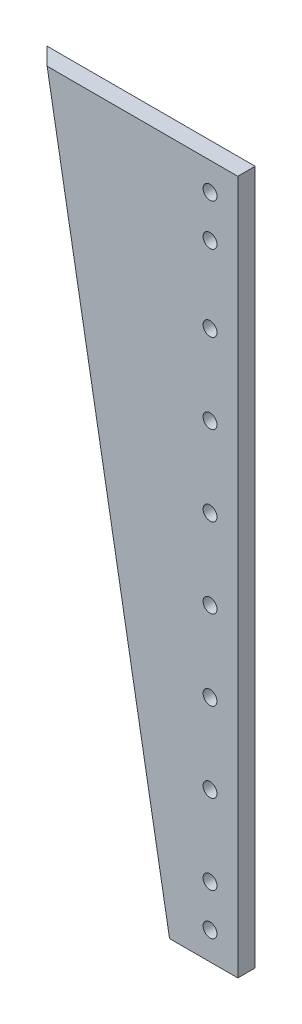
ISO-10303-21;
HEADER;
FILE_DESCRIPTION(('STEP AP214'),'2;1');
FILE_NAME('part.step','',(''),(''),'','','');
FILE_SCHEMA(('AUTOMOTIVE_DESIGN { 1 0 10303 214 1 1 1 1 }'));
ENDSEC;
DATA;
#1=APPLICATION_CONTEXT('core data for automotive mechanical design processes');
#2=APPLICATION_PROTOCOL_DEFINITION('international standard','automotive_design',2000,#1);
#3=PRODUCT_CONTEXT('',#1,'mechanical');
#4=PRODUCT('Part','Part','',(#3));
#5=PRODUCT_RELATED_PRODUCT_CATEGORY('part','',(#4));
#6=PRODUCT_DEFINITION_FORMATION('','',#4);
#7=PRODUCT_DEFINITION_CONTEXT('part definition',#1,'design');
#8=PRODUCT_DEFINITION('design','',#6,#7);
#9=PRODUCT_DEFINITION_SHAPE('','',#8);
#10=(LENGTH_UNIT() NAMED_UNIT(*) SI_UNIT(.MILLI.,.METRE.));
#11=(NAMED_UNIT(*) PLANE_ANGLE_UNIT() SI_UNIT($,.RADIAN.));
#12=(NAMED_UNIT(*) SI_UNIT($,.STERADIAN.) SOLID_ANGLE_UNIT());
#13=UNCERTAINTY_MEASURE_WITH_UNIT(LENGTH_MEASURE(1.E-05),#10,'distance_accuracy_value','');
#14=(GEOMETRIC_REPRESENTATION_CONTEXT(3) GLOBAL_UNCERTAINTY_ASSIGNED_CONTEXT((#13)) GLOBAL_UNIT_ASSIGNED_CONTEXT((#10,
#11,#12)) REPRESENTATION_CONTEXT('',''));
#15=CARTESIAN_POINT('',(0.,0.,0.));
#16=DIRECTION('',(0.,0.,1.));
#17=DIRECTION('',(1.,0.,0.));
#18=AXIS2_PLACEMENT_3D('',#15,#16,#17);
#19=CARTESIAN_POINT('',(-60.,0.,5.));
#20=DIRECTION('',(0.,1.,0.));
#21=DIRECTION('',(0.,0.,1.));
#22=AXIS2_PLACEMENT_3D('',#19,#20,#21);
#23=PLANE('',#22);
#24=DIRECTION('',(1.,0.,0.));
#25=VECTOR('',#24,1.);
#26=CARTESIAN_POINT('',(-60.,0.,5.));
#27=LINE('',#26,#25);
#28=CARTESIAN_POINT('',(-19.6574707988797,0.,5.));
#29=VERTEX_POINT('',#28);
#30=CARTESIAN_POINT('',(0.,0.,5.));
#31=VERTEX_POINT('',#30);
#32=EDGE_CURVE('E77',#29,#31,#27,.T.);
#33=ORIENTED_EDGE('',*,*,#32,.F.);
#34=DIRECTION('',(-0.712498293208669,0.,-0.701673843159864));
#35=VECTOR('',#34,1.);
#36=CARTESIAN_POINT('',(-19.3565613980794,0.,5.29633791086235));
#37=LINE('',#36,#35);
#38=CARTESIAN_POINT('',(-24.7346038583084,0.,0.));
#39=VERTEX_POINT('',#38);
#40=EDGE_CURVE('E41',#29,#39,#37,.T.);
#41=ORIENTED_EDGE('',*,*,#40,.T.);
#42=DIRECTION('',(1.,0.,0.));
#43=VECTOR('',#42,1.);
#44=CARTESIAN_POINT('',(-60.,0.,0.));
#45=LINE('',#44,#43);
#46=CARTESIAN_POINT('',(0.,0.,0.));
#47=VERTEX_POINT('',#46);
#48=EDGE_CURVE('E75',#39,#47,#45,.T.);
#49=ORIENTED_EDGE('',*,*,#48,.T.);
#50=DIRECTION('',(0.,0.,-1.));
#51=VECTOR('',#50,1.);
#52=CARTESIAN_POINT('',(0.,0.,5.));
#53=LINE('',#52,#51);
#54=EDGE_CURVE('E159',#31,#47,#53,.T.);
#55=ORIENTED_EDGE('',*,*,#54,.F.);
#56=EDGE_LOOP('',(#33,#41,#49,#55));
#57=FACE_BOUND('',#56,.T.);
#58=ADVANCED_FACE('F33',(#57),#23,.F.);
#59=CARTESIAN_POINT('',(0.,200.,5.));
#60=DIRECTION('',(-1.,0.,0.));
#61=DIRECTION('',(0.,-1.,0.));
#62=AXIS2_PLACEMENT_3D('',#59,#60,#61);
#63=PLANE('',#62);
#64=DIRECTION('',(0.,1.,0.));
#65=VECTOR('',#64,1.);
#66=CARTESIAN_POINT('',(0.,200.,0.));
#67=LINE('',#66,#65);
#68=CARTESIAN_POINT('',(0.,200.,0.));
#69=VERTEX_POINT('',#68);
#70=EDGE_CURVE('E84',#47,#69,#67,.T.);
#71=ORIENTED_EDGE('',*,*,#70,.T.);
#72=DIRECTION('',(0.,0.,-1.));
#73=VECTOR('',#72,1.);
#74=CARTESIAN_POINT('',(0.,200.,5.));
#75=LINE('',#74,#73);
#76=CARTESIAN_POINT('',(0.,200.,5.));
#77=VERTEX_POINT('',#76);
#78=EDGE_CURVE('E153',#77,#69,#75,.T.);
#79=ORIENTED_EDGE('',*,*,#78,.F.);
#80=DIRECTION('',(0.,1.,0.));
#81=VECTOR('',#80,1.);
#82=CARTESIAN_POINT('',(0.,200.,5.));
#83=LINE('',#82,#81);
#84=EDGE_CURVE('E149',#31,#77,#83,.T.);
#85=ORIENTED_EDGE('',*,*,#84,.F.);
#86=ORIENTED_EDGE('',*,*,#54,.T.);
#87=EDGE_LOOP('',(#71,#79,#85,#86));
#88=FACE_BOUND('',#87,.T.);
#89=ADVANCED_FACE('F168',(#88),#63,.F.);
#90=CARTESIAN_POINT('',(-60.,200.,5.));
#91=DIRECTION('',(0.,-1.,0.));
#92=DIRECTION('',(0.,0.,-1.));
#93=AXIS2_PLACEMENT_3D('',#90,#91,#92);
#94=PLANE('',#93);
#95=DIRECTION('',(-1.,0.,0.));
#96=VECTOR('',#95,1.);
#97=CARTESIAN_POINT('',(-60.,200.,0.));
#98=LINE('',#97,#96);
#99=CARTESIAN_POINT('',(-60.,200.,0.));
#100=VERTEX_POINT('',#99);
#101=EDGE_CURVE('E150',#69,#100,#98,.T.);
#102=ORIENTED_EDGE('',*,*,#101,.T.);
#103=DIRECTION('',(0.712498293208669,0.,0.701673843159864));
#104=VECTOR('',#103,1.);
#105=CARTESIAN_POINT('',(-36.7193445513209,200.,22.9269699810652));
#106=LINE('',#105,#104);
#107=CARTESIAN_POINT('',(-54.9228669405713,200.,5.));
#108=VERTEX_POINT('',#107);
#109=EDGE_CURVE('E11',#100,#108,#106,.T.);
#110=ORIENTED_EDGE('',*,*,#109,.T.);
#111=DIRECTION('',(-1.,0.,0.));
#112=VECTOR('',#111,1.);
#113=CARTESIAN_POINT('',(-60.,200.,5.));
#114=LINE('',#113,#112);
#115=EDGE_CURVE('E152',#77,#108,#114,.T.);
#116=ORIENTED_EDGE('',*,*,#115,.F.);
#117=ORIENTED_EDGE('',*,*,#78,.T.);
#118=EDGE_LOOP('',(#102,#110,#116,#117));
#119=FACE_BOUND('',#118,.T.);
#120=ADVANCED_FACE('F166',(#119),#94,.F.);
#121=CARTESIAN_POINT('',(0.,0.,5.));
#122=DIRECTION('',(0.,0.,1.));
#123=DIRECTION('',(1.,0.,0.));
#124=AXIS2_PLACEMENT_3D('',#121,#122,#123);
#125=PLANE('',#124);
#126=ORIENTED_EDGE('',*,*,#115,.T.);
#127=DIRECTION('',(0.173648177666924,-0.984807753012209,0.));
#128=VECTOR('',#127,1.);
#129=CARTESIAN_POINT('',(-19.8105650932473,0.868240888334619,5.));
#130=LINE('',#129,#128);
#131=EDGE_CURVE('E78',#108,#29,#130,.T.);
#132=ORIENTED_EDGE('',*,*,#131,.T.);
#133=ORIENTED_EDGE('',*,*,#32,.T.);
#134=ORIENTED_EDGE('',*,*,#84,.T.);
#135=EDGE_LOOP('',(#126,#132,#133,#134));
#136=FACE_BOUND('',#135,.T.);
#137=CARTESIAN_POINT('',(-8.,66.,5.));
#138=DIRECTION('',(0.,0.,1.));
#139=DIRECTION('',(1.,0.,0.));
#140=AXIS2_PLACEMENT_3D('',#137,#138,#139);
#141=CIRCLE('',#140,2.);
#142=CARTESIAN_POINT('',(-6.,66.,5.));
#143=VERTEX_POINT('',#142);
#144=EDGE_CURVE('E96',#143,#143,#141,.T.);
#145=ORIENTED_EDGE('',*,*,#144,.F.);
#146=EDGE_LOOP('',(#145));
#147=FACE_BOUND('',#146,.T.);
#148=CARTESIAN_POINT('',(-8.00000000000001,89.,5.));
#149=DIRECTION('',(0.,0.,1.));
#150=DIRECTION('',(1.,0.,0.));
#151=AXIS2_PLACEMENT_3D('',#148,#149,#150);
#152=CIRCLE('',#151,2.);
#153=CARTESIAN_POINT('',(-6.,89.,5.));
#154=VERTEX_POINT('',#153);
#155=EDGE_CURVE('E97',#154,#154,#152,.T.);
#156=ORIENTED_EDGE('',*,*,#155,.F.);
#157=EDGE_LOOP('',(#156));
#158=FACE_BOUND('',#157,.T.);
#159=CARTESIAN_POINT('',(-8.00000000000001,112.,5.));
#160=DIRECTION('',(0.,0.,1.));
#161=DIRECTION('',(1.,0.,0.));
#162=AXIS2_PLACEMENT_3D('',#159,#160,#161);
#163=CIRCLE('',#162,2.);
#164=CARTESIAN_POINT('',(-6.00000000000001,112.,5.));
#165=VERTEX_POINT('',#164);
#166=EDGE_CURVE('E104',#165,#165,#163,.T.);
#167=ORIENTED_EDGE('',*,*,#166,.F.);
#168=EDGE_LOOP('',(#167));
#169=FACE_BOUND('',#168,.T.);
#170=CARTESIAN_POINT('',(-8.00000000000001,135.,5.));
#171=DIRECTION('',(0.,0.,1.));
#172=DIRECTION('',(1.,0.,0.));
#173=AXIS2_PLACEMENT_3D('',#170,#171,#172);
#174=CIRCLE('',#173,2.);
#175=CARTESIAN_POINT('',(-6.00000000000001,135.,5.));
#176=VERTEX_POINT('',#175);
#177=EDGE_CURVE('E110',#176,#176,#174,.T.);
#178=ORIENTED_EDGE('',*,*,#177,.F.);
#179=EDGE_LOOP('',(#178));
#180=FACE_BOUND('',#179,.T.);
#181=CARTESIAN_POINT('',(-8.00000000000001,158.,5.));
#182=DIRECTION('',(0.,0.,1.));
#183=DIRECTION('',(1.,0.,0.));
#184=AXIS2_PLACEMENT_3D('',#181,#182,#183);
#185=CIRCLE('',#184,2.);
#186=CARTESIAN_POINT('',(-6.00000000000001,158.,5.));
#187=VERTEX_POINT('',#186);
#188=EDGE_CURVE('E90',#187,#187,#185,.T.);
#189=ORIENTED_EDGE('',*,*,#188,.F.);
#190=EDGE_LOOP('',(#189));
#191=FACE_BOUND('',#190,.T.);
#192=CARTESIAN_POINT('',(-8.,43.,5.));
#193=DIRECTION('',(0.,0.,1.));
#194=DIRECTION('',(1.,0.,0.));
#195=AXIS2_PLACEMENT_3D('',#192,#193,#194);
#196=CIRCLE('',#195,2.);
#197=CARTESIAN_POINT('',(-6.,43.,5.));
#198=VERTEX_POINT('',#197);
#199=EDGE_CURVE('E122',#198,#198,#196,.T.);
#200=ORIENTED_EDGE('',*,*,#199,.F.);
#201=EDGE_LOOP('',(#200));
#202=FACE_BOUND('',#201,.T.);
#203=CARTESIAN_POINT('',(-8.,192.,5.));
#204=DIRECTION('',(0.,0.,1.));
#205=DIRECTION('',(1.,0.,0.));
#206=AXIS2_PLACEMENT_3D('',#203,#204,#205);
#207=CIRCLE('',#206,2.);
#208=CARTESIAN_POINT('',(-6.,192.,5.));
#209=VERTEX_POINT('',#208);
#210=EDGE_CURVE('E129',#209,#209,#207,.F.);
#211=ORIENTED_EDGE('',*,*,#210,.T.);
#212=EDGE_LOOP('',(#211));
#213=FACE_BOUND('',#212,.T.);
#214=CARTESIAN_POINT('',(-8.,180.,5.));
#215=DIRECTION('',(0.,0.,1.));
#216=DIRECTION('',(1.,0.,0.));
#217=AXIS2_PLACEMENT_3D('',#214,#215,#216);
#218=CIRCLE('',#217,2.);
#219=CARTESIAN_POINT('',(-6.,180.,5.));
#220=VERTEX_POINT('',#219);
#221=EDGE_CURVE('E130',#220,#220,#218,.F.);
#222=ORIENTED_EDGE('',*,*,#221,.T.);
#223=EDGE_LOOP('',(#222));
#224=FACE_BOUND('',#223,.T.);
#225=CARTESIAN_POINT('',(-8.,8.,5.));
#226=DIRECTION('',(0.,0.,1.));
#227=DIRECTION('',(1.,0.,0.));
#228=AXIS2_PLACEMENT_3D('',#225,#226,#227);
#229=CIRCLE('',#228,2.);
#230=CARTESIAN_POINT('',(-6.,8.,5.));
#231=VERTEX_POINT('',#230);
#232=EDGE_CURVE('E85',#231,#231,#229,.T.);
#233=ORIENTED_EDGE('',*,*,#232,.F.);
#234=EDGE_LOOP('',(#233));
#235=FACE_BOUND('',#234,.T.);
#236=CARTESIAN_POINT('',(-8.,20.,5.));
#237=DIRECTION('',(0.,0.,1.));
#238=DIRECTION('',(1.,0.,0.));
#239=AXIS2_PLACEMENT_3D('',#236,#237,#238);
#240=CIRCLE('',#239,2.);
#241=CARTESIAN_POINT('',(-6.,20.,5.));
#242=VERTEX_POINT('',#241);
#243=EDGE_CURVE('E141',#242,#242,#240,.T.);
#244=ORIENTED_EDGE('',*,*,#243,.F.);
#245=EDGE_LOOP('',(#244));
#246=FACE_BOUND('',#245,.T.);
#247=ADVANCED_FACE('F162',(#136,#147,#158,#169,#180,#191,#202,#213,#224,#235,#246),#125,.T.);
#248=CARTESIAN_POINT('',(0.,0.,0.));
#249=DIRECTION('',(0.,0.,1.));
#250=DIRECTION('',(1.,0.,0.));
#251=AXIS2_PLACEMENT_3D('',#248,#249,#250);
#252=PLANE('',#251);
#253=CARTESIAN_POINT('',(-8.,66.,0.));
#254=DIRECTION('',(0.,0.,1.));
#255=DIRECTION('',(1.,0.,0.));
#256=AXIS2_PLACEMENT_3D('',#253,#254,#255);
#257=CIRCLE('',#256,2.);
#258=CARTESIAN_POINT('',(-6.,66.,0.));
#259=VERTEX_POINT('',#258);
#260=EDGE_CURVE('E93',#259,#259,#257,.T.);
#261=ORIENTED_EDGE('',*,*,#260,.T.);
#262=EDGE_LOOP('',(#261));
#263=FACE_BOUND('',#262,.T.);
#264=CARTESIAN_POINT('',(-8.00000000000001,89.,0.));
#265=DIRECTION('',(0.,0.,1.));
#266=DIRECTION('',(1.,0.,0.));
#267=AXIS2_PLACEMENT_3D('',#264,#265,#266);
#268=CIRCLE('',#267,2.);
#269=CARTESIAN_POINT('',(-6.,89.,0.));
#270=VERTEX_POINT('',#269);
#271=EDGE_CURVE('E101',#270,#270,#268,.T.);
#272=ORIENTED_EDGE('',*,*,#271,.T.);
#273=EDGE_LOOP('',(#272));
#274=FACE_BOUND('',#273,.T.);
#275=CARTESIAN_POINT('',(-8.00000000000001,112.,0.));
#276=DIRECTION('',(0.,0.,1.));
#277=DIRECTION('',(1.,0.,0.));
#278=AXIS2_PLACEMENT_3D('',#275,#276,#277);
#279=CIRCLE('',#278,2.);
#280=CARTESIAN_POINT('',(-6.00000000000001,112.,0.));
#281=VERTEX_POINT('',#280);
#282=EDGE_CURVE('E107',#281,#281,#279,.T.);
#283=ORIENTED_EDGE('',*,*,#282,.T.);
#284=EDGE_LOOP('',(#283));
#285=FACE_BOUND('',#284,.T.);
#286=CARTESIAN_POINT('',(-8.00000000000001,135.,0.));
#287=DIRECTION('',(0.,0.,1.));
#288=DIRECTION('',(1.,0.,0.));
#289=AXIS2_PLACEMENT_3D('',#286,#287,#288);
#290=CIRCLE('',#289,2.);
#291=CARTESIAN_POINT('',(-6.00000000000001,135.,0.));
#292=VERTEX_POINT('',#291);
#293=EDGE_CURVE('E113',#292,#292,#290,.T.);
#294=ORIENTED_EDGE('',*,*,#293,.T.);
#295=EDGE_LOOP('',(#294));
#296=FACE_BOUND('',#295,.T.);
#297=CARTESIAN_POINT('',(-8.00000000000001,158.,0.));
#298=DIRECTION('',(0.,0.,1.));
#299=DIRECTION('',(1.,0.,0.));
#300=AXIS2_PLACEMENT_3D('',#297,#298,#299);
#301=CIRCLE('',#300,2.);
#302=CARTESIAN_POINT('',(-6.00000000000001,158.,0.));
#303=VERTEX_POINT('',#302);
#304=EDGE_CURVE('E87',#303,#303,#301,.T.);
#305=ORIENTED_EDGE('',*,*,#304,.T.);
#306=EDGE_LOOP('',(#305));
#307=FACE_BOUND('',#306,.T.);
#308=CARTESIAN_POINT('',(-8.,43.,0.));
#309=DIRECTION('',(0.,0.,1.));
#310=DIRECTION('',(1.,0.,0.));
#311=AXIS2_PLACEMENT_3D('',#308,#309,#310);
#312=CIRCLE('',#311,2.);
#313=CARTESIAN_POINT('',(-6.,43.,0.));
#314=VERTEX_POINT('',#313);
#315=EDGE_CURVE('E100',#314,#314,#312,.T.);
#316=ORIENTED_EDGE('',*,*,#315,.T.);
#317=EDGE_LOOP('',(#316));
#318=FACE_BOUND('',#317,.T.);
#319=CARTESIAN_POINT('',(-8.,192.,0.));
#320=DIRECTION('',(0.,0.,-1.));
#321=DIRECTION('',(1.,0.,0.));
#322=AXIS2_PLACEMENT_3D('',#319,#320,#321);
#323=CIRCLE('',#322,2.);
#324=CARTESIAN_POINT('',(-6.,192.,0.));
#325=VERTEX_POINT('',#324);
#326=EDGE_CURVE('E126',#325,#325,#323,.T.);
#327=ORIENTED_EDGE('',*,*,#326,.F.);
#328=EDGE_LOOP('',(#327));
#329=FACE_BOUND('',#328,.T.);
#330=CARTESIAN_POINT('',(-8.,180.,0.));
#331=DIRECTION('',(0.,0.,-1.));
#332=DIRECTION('',(1.,0.,0.));
#333=AXIS2_PLACEMENT_3D('',#330,#331,#332);
#334=CIRCLE('',#333,2.);
#335=CARTESIAN_POINT('',(-6.,180.,0.));
#336=VERTEX_POINT('',#335);
#337=EDGE_CURVE('E125',#336,#336,#334,.T.);
#338=ORIENTED_EDGE('',*,*,#337,.F.);
#339=EDGE_LOOP('',(#338));
#340=FACE_BOUND('',#339,.T.);
#341=CARTESIAN_POINT('',(-8.,8.,0.));
#342=DIRECTION('',(0.,0.,1.));
#343=DIRECTION('',(1.,0.,0.));
#344=AXIS2_PLACEMENT_3D('',#341,#342,#343);
#345=CIRCLE('',#344,2.);
#346=CARTESIAN_POINT('',(-6.,8.,0.));
#347=VERTEX_POINT('',#346);
#348=EDGE_CURVE('E138',#347,#347,#345,.T.);
#349=ORIENTED_EDGE('',*,*,#348,.T.);
#350=EDGE_LOOP('',(#349));
#351=FACE_BOUND('',#350,.T.);
#352=CARTESIAN_POINT('',(-8.,20.,0.));
#353=DIRECTION('',(0.,0.,1.));
#354=DIRECTION('',(1.,0.,0.));
#355=AXIS2_PLACEMENT_3D('',#352,#353,#354);
#356=CIRCLE('',#355,2.);
#357=CARTESIAN_POINT('',(-6.,20.,0.));
#358=VERTEX_POINT('',#357);
#359=EDGE_CURVE('E133',#358,#358,#356,.T.);
#360=ORIENTED_EDGE('',*,*,#359,.T.);
#361=EDGE_LOOP('',(#360));
#362=FACE_BOUND('',#361,.T.);
#363=ORIENTED_EDGE('',*,*,#48,.F.);
#364=DIRECTION('',(0.173648177666924,-0.984807753012209,0.));
#365=VECTOR('',#364,1.);
#366=CARTESIAN_POINT('',(-24.7346038583084,0.,0.));
#367=LINE('',#366,#365);
#368=EDGE_CURVE('E83',#100,#39,#367,.T.);
#369=ORIENTED_EDGE('',*,*,#368,.F.);
#370=ORIENTED_EDGE('',*,*,#101,.F.);
#371=ORIENTED_EDGE('',*,*,#70,.F.);
#372=EDGE_LOOP('',(#363,#369,#370,#371));
#373=FACE_BOUND('',#372,.T.);
#374=ADVANCED_FACE('F81',(#263,#274,#285,#296,#307,#318,#329,#340,#351,#362,#373),#252,.F.);
#375=CARTESIAN_POINT('',(-8.,20.,10.6568542494924));
#376=DIRECTION('',(0.,0.,-1.));
#377=DIRECTION('',(-1.,0.,0.));
#378=AXIS2_PLACEMENT_3D('',#375,#376,#377);
#379=CYLINDRICAL_SURFACE('',#378,2.);
#380=ORIENTED_EDGE('',*,*,#359,.F.);
#381=EDGE_LOOP('',(#380));
#382=FACE_BOUND('',#381,.T.);
#383=ORIENTED_EDGE('',*,*,#243,.T.);
#384=EDGE_LOOP('',(#383));
#385=FACE_BOUND('',#384,.T.);
#386=ADVANCED_FACE('F179',(#382,#385),#379,.F.);
#387=CARTESIAN_POINT('',(-8.,8.,10.6568542494924));
#388=DIRECTION('',(0.,0.,-1.));
#389=DIRECTION('',(-1.,0.,0.));
#390=AXIS2_PLACEMENT_3D('',#387,#388,#389);
#391=CYLINDRICAL_SURFACE('',#390,2.);
#392=ORIENTED_EDGE('',*,*,#348,.F.);
#393=EDGE_LOOP('',(#392));
#394=FACE_BOUND('',#393,.T.);
#395=ORIENTED_EDGE('',*,*,#232,.T.);
#396=EDGE_LOOP('',(#395));
#397=FACE_BOUND('',#396,.T.);
#398=ADVANCED_FACE('F185',(#394,#397),#391,.F.);
#399=CARTESIAN_POINT('',(-8.,180.,10.6568542494924));
#400=DIRECTION('',(0.,0.,-1.));
#401=DIRECTION('',(-1.,0.,0.));
#402=AXIS2_PLACEMENT_3D('',#399,#400,#401);
#403=CYLINDRICAL_SURFACE('',#402,2.);
#404=ORIENTED_EDGE('',*,*,#337,.T.);
#405=EDGE_LOOP('',(#404));
#406=FACE_BOUND('',#405,.T.);
#407=ORIENTED_EDGE('',*,*,#221,.F.);
#408=EDGE_LOOP('',(#407));
#409=FACE_BOUND('',#408,.T.);
#410=ADVANCED_FACE('F189',(#406,#409),#403,.F.);
#411=CARTESIAN_POINT('',(-8.,192.,10.6568542494924));
#412=DIRECTION('',(0.,0.,-1.));
#413=DIRECTION('',(-1.,0.,0.));
#414=AXIS2_PLACEMENT_3D('',#411,#412,#413);
#415=CYLINDRICAL_SURFACE('',#414,2.);
#416=ORIENTED_EDGE('',*,*,#326,.T.);
#417=EDGE_LOOP('',(#416));
#418=FACE_BOUND('',#417,.T.);
#419=ORIENTED_EDGE('',*,*,#210,.F.);
#420=EDGE_LOOP('',(#419));
#421=FACE_BOUND('',#420,.T.);
#422=ADVANCED_FACE('F193',(#418,#421),#415,.F.);
#423=CARTESIAN_POINT('',(-8.,43.,10.6568542494924));
#424=DIRECTION('',(0.,0.,-1.));
#425=DIRECTION('',(-1.,0.,0.));
#426=AXIS2_PLACEMENT_3D('',#423,#424,#425);
#427=CYLINDRICAL_SURFACE('',#426,2.);
#428=ORIENTED_EDGE('',*,*,#315,.F.);
#429=EDGE_LOOP('',(#428));
#430=FACE_BOUND('',#429,.T.);
#431=ORIENTED_EDGE('',*,*,#199,.T.);
#432=EDGE_LOOP('',(#431));
#433=FACE_BOUND('',#432,.T.);
#434=ADVANCED_FACE('F197',(#430,#433),#427,.F.);
#435=CARTESIAN_POINT('',(-8.00000000000001,158.,10.6568542494924));
#436=DIRECTION('',(0.,0.,-1.));
#437=DIRECTION('',(-1.,0.,0.));
#438=AXIS2_PLACEMENT_3D('',#435,#436,#437);
#439=CYLINDRICAL_SURFACE('',#438,2.);
#440=ORIENTED_EDGE('',*,*,#304,.F.);
#441=EDGE_LOOP('',(#440));
#442=FACE_BOUND('',#441,.T.);
#443=ORIENTED_EDGE('',*,*,#188,.T.);
#444=EDGE_LOOP('',(#443));
#445=FACE_BOUND('',#444,.T.);
#446=ADVANCED_FACE('F201',(#442,#445),#439,.F.);
#447=CARTESIAN_POINT('',(-8.00000000000001,135.,10.6568542494924));
#448=DIRECTION('',(0.,0.,-1.));
#449=DIRECTION('',(-1.,0.,0.));
#450=AXIS2_PLACEMENT_3D('',#447,#448,#449);
#451=CYLINDRICAL_SURFACE('',#450,2.);
#452=ORIENTED_EDGE('',*,*,#293,.F.);
#453=EDGE_LOOP('',(#452));
#454=FACE_BOUND('',#453,.T.);
#455=ORIENTED_EDGE('',*,*,#177,.T.);
#456=EDGE_LOOP('',(#455));
#457=FACE_BOUND('',#456,.T.);
#458=ADVANCED_FACE('F205',(#454,#457),#451,.F.);
#459=CARTESIAN_POINT('',(-8.00000000000001,112.,10.6568542494924));
#460=DIRECTION('',(0.,0.,-1.));
#461=DIRECTION('',(-1.,0.,0.));
#462=AXIS2_PLACEMENT_3D('',#459,#460,#461);
#463=CYLINDRICAL_SURFACE('',#462,2.);
#464=ORIENTED_EDGE('',*,*,#282,.F.);
#465=EDGE_LOOP('',(#464));
#466=FACE_BOUND('',#465,.T.);
#467=ORIENTED_EDGE('',*,*,#166,.T.);
#468=EDGE_LOOP('',(#467));
#469=FACE_BOUND('',#468,.T.);
#470=ADVANCED_FACE('F209',(#466,#469),#463,.F.);
#471=CARTESIAN_POINT('',(-8.00000000000001,89.,10.6568542494924));
#472=DIRECTION('',(0.,0.,-1.));
#473=DIRECTION('',(-1.,0.,0.));
#474=AXIS2_PLACEMENT_3D('',#471,#472,#473);
#475=CYLINDRICAL_SURFACE('',#474,2.);
#476=ORIENTED_EDGE('',*,*,#271,.F.);
#477=EDGE_LOOP('',(#476));
#478=FACE_BOUND('',#477,.T.);
#479=ORIENTED_EDGE('',*,*,#155,.T.);
#480=EDGE_LOOP('',(#479));
#481=FACE_BOUND('',#480,.T.);
#482=ADVANCED_FACE('F213',(#478,#481),#475,.F.);
#483=CARTESIAN_POINT('',(-8.,66.,10.6568542494924));
#484=DIRECTION('',(0.,0.,-1.));
#485=DIRECTION('',(-1.,0.,0.));
#486=AXIS2_PLACEMENT_3D('',#483,#484,#485);
#487=CYLINDRICAL_SURFACE('',#486,2.);
#488=ORIENTED_EDGE('',*,*,#260,.F.);
#489=EDGE_LOOP('',(#488));
#490=FACE_BOUND('',#489,.T.);
#491=ORIENTED_EDGE('',*,*,#144,.T.);
#492=EDGE_LOOP('',(#491));
#493=FACE_BOUND('',#492,.T.);
#494=ADVANCED_FACE('F217',(#490,#493),#487,.F.);
#495=CARTESIAN_POINT('',(-19.0647255259507,-3.36162549002636,5.));
#496=DIRECTION('',(-0.69636424032002,-0.122787803968968,0.707106781186547));
#497=DIRECTION('',(-0.173648177666924,0.984807753012209,0.));
#498=AXIS2_PLACEMENT_3D('',#495,#496,#497);
#499=PLANE('',#498);
#500=ORIENTED_EDGE('',*,*,#109,.F.);
#501=ORIENTED_EDGE('',*,*,#368,.T.);
#502=ORIENTED_EDGE('',*,*,#40,.F.);
#503=ORIENTED_EDGE('',*,*,#131,.F.);
#504=EDGE_LOOP('',(#500,#501,#502,#503));
#505=FACE_BOUND('',#504,.T.);
#506=ADVANCED_FACE('F35',(#505),#499,.T.);
#507=CLOSED_SHELL('',(#58,#89,#120,#247,#374,#386,#398,#410,#422,#434,#446,#458,#470,#482,#494,#506));
#508=MANIFOLD_SOLID_BREP('B2',#507);
#509=ADVANCED_BREP_SHAPE_REPRESENTATION('',(#18,#508),#14);
#510=SHAPE_DEFINITION_REPRESENTATION(#9,#509);
ENDSEC;
END-ISO-10303-21;
